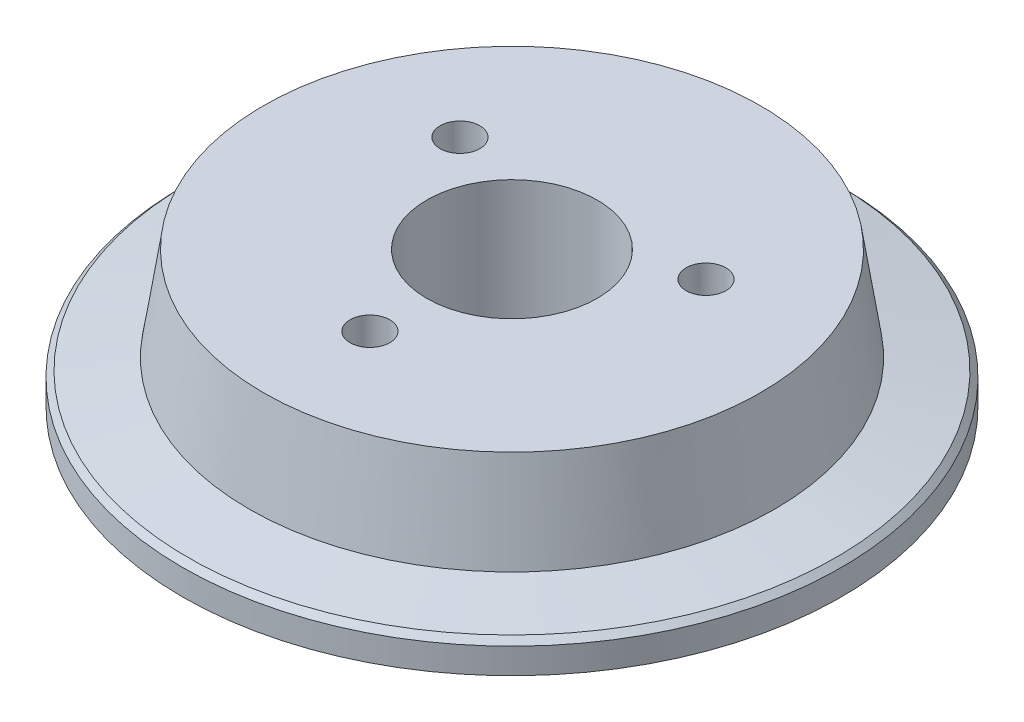
ISO-10303-21;
HEADER;
FILE_DESCRIPTION(('STEP AP214'),'2;1');
FILE_NAME('part.step','',(''),(''),'','','');
FILE_SCHEMA(('AUTOMOTIVE_DESIGN { 1 0 10303 214 1 1 1 1 }'));
ENDSEC;
DATA;
#1=APPLICATION_CONTEXT('core data for automotive mechanical design processes');
#2=APPLICATION_PROTOCOL_DEFINITION('international standard','automotive_design',2000,#1);
#3=PRODUCT_CONTEXT('',#1,'mechanical');
#4=PRODUCT('Part','Part','',(#3));
#5=PRODUCT_RELATED_PRODUCT_CATEGORY('part','',(#4));
#6=PRODUCT_DEFINITION_FORMATION('','',#4);
#7=PRODUCT_DEFINITION_CONTEXT('part definition',#1,'design');
#8=PRODUCT_DEFINITION('design','',#6,#7);
#9=PRODUCT_DEFINITION_SHAPE('','',#8);
#10=(LENGTH_UNIT() NAMED_UNIT(*) SI_UNIT(.MILLI.,.METRE.));
#11=(NAMED_UNIT(*) PLANE_ANGLE_UNIT() SI_UNIT($,.RADIAN.));
#12=(NAMED_UNIT(*) SI_UNIT($,.STERADIAN.) SOLID_ANGLE_UNIT());
#13=UNCERTAINTY_MEASURE_WITH_UNIT(LENGTH_MEASURE(1.E-05),#10,'distance_accuracy_value','');
#14=(GEOMETRIC_REPRESENTATION_CONTEXT(3) GLOBAL_UNCERTAINTY_ASSIGNED_CONTEXT((#13)) GLOBAL_UNIT_ASSIGNED_CONTEXT((#10,
#11,#12)) REPRESENTATION_CONTEXT('',''));
#15=CARTESIAN_POINT('',(0.,0.,0.));
#16=DIRECTION('',(0.,0.,1.));
#17=DIRECTION('',(1.,0.,0.));
#18=AXIS2_PLACEMENT_3D('',#15,#16,#17);
#19=CARTESIAN_POINT('',(0.,0.,0.));
#20=DIRECTION('',(0.,1.,0.));
#21=DIRECTION('',(0.,0.,1.));
#22=AXIS2_PLACEMENT_3D('',#19,#20,#21);
#23=PLANE('',#22);
#24=CARTESIAN_POINT('',(0.,0.,0.));
#25=DIRECTION('',(0.,1.,0.));
#26=DIRECTION('',(0.,0.,1.));
#27=AXIS2_PLACEMENT_3D('',#24,#25,#26);
#28=CIRCLE('',#27,3.);
#29=CARTESIAN_POINT('',(0.,0.,3.));
#30=VERTEX_POINT('',#29);
#31=EDGE_CURVE('E79',#30,#30,#28,.T.);
#32=ORIENTED_EDGE('',*,*,#31,.T.);
#33=EDGE_LOOP('',(#32));
#34=FACE_BOUND('',#33,.T.);
#35=CARTESIAN_POINT('',(0.,0.,0.));
#36=DIRECTION('',(0.,1.,0.));
#37=DIRECTION('',(0.,0.,1.));
#38=AXIS2_PLACEMENT_3D('',#35,#36,#37);
#39=CIRCLE('',#38,11.6);
#40=CARTESIAN_POINT('',(0.,0.,11.6));
#41=VERTEX_POINT('',#40);
#42=EDGE_CURVE('E70',#41,#41,#39,.T.);
#43=ORIENTED_EDGE('',*,*,#42,.F.);
#44=EDGE_LOOP('',(#43));
#45=FACE_BOUND('',#44,.T.);
#46=ADVANCED_FACE('F53',(#34,#45),#23,.F.);
#47=CARTESIAN_POINT('',(0.,1.1,0.));
#48=DIRECTION('',(0.,-1.,0.));
#49=DIRECTION('',(0.,0.,-1.));
#50=AXIS2_PLACEMENT_3D('',#47,#48,#49);
#51=CYLINDRICAL_SURFACE('',#50,11.6);
#52=CARTESIAN_POINT('',(0.,0.900000000000005,0.));
#53=DIRECTION('',(0.,1.,0.));
#54=DIRECTION('',(0.,0.,1.));
#55=AXIS2_PLACEMENT_3D('',#52,#53,#54);
#56=CIRCLE('',#55,11.6);
#57=CARTESIAN_POINT('',(0.,0.900000000000005,11.6));
#58=VERTEX_POINT('',#57);
#59=EDGE_CURVE('E61',#58,#58,#56,.F.);
#60=ORIENTED_EDGE('',*,*,#59,.T.);
#61=EDGE_LOOP('',(#60));
#62=FACE_BOUND('',#61,.T.);
#63=ORIENTED_EDGE('',*,*,#42,.T.);
#64=EDGE_LOOP('',(#63));
#65=FACE_BOUND('',#64,.T.);
#66=ADVANCED_FACE('F137',(#62,#65),#51,.T.);
#67=CARTESIAN_POINT('',(0.,1.1,0.));
#68=DIRECTION('',(0.,-1.,0.));
#69=DIRECTION('',(0.,0.,-1.));
#70=AXIS2_PLACEMENT_3D('',#67,#68,#69);
#71=CONICAL_SURFACE('',#70,11.4,0.785398163397461);
#72=ORIENTED_EDGE('',*,*,#59,.F.);
#73=EDGE_LOOP('',(#72));
#74=FACE_BOUND('',#73,.T.);
#75=CARTESIAN_POINT('',(0.,1.1,0.));
#76=DIRECTION('',(0.,-1.,0.));
#77=DIRECTION('',(0.,0.,-1.));
#78=AXIS2_PLACEMENT_3D('',#75,#76,#77);
#79=CIRCLE('',#78,11.4);
#80=CARTESIAN_POINT('',(0.,1.1,-11.4));
#81=VERTEX_POINT('',#80);
#82=EDGE_CURVE('E65',#81,#81,#79,.F.);
#83=ORIENTED_EDGE('',*,*,#82,.F.);
#84=EDGE_LOOP('',(#83));
#85=FACE_BOUND('',#84,.T.);
#86=ADVANCED_FACE('F143',(#74,#85),#71,.T.);
#87=CARTESIAN_POINT('',(0.,1.5,0.));
#88=DIRECTION('',(0.,-1.,0.));
#89=DIRECTION('',(0.,0.,-1.));
#90=AXIS2_PLACEMENT_3D('',#87,#88,#89);
#91=CONICAL_SURFACE('',#90,9.25,1.38685287025772);
#92=CARTESIAN_POINT('',(0.,1.5,0.));
#93=DIRECTION('',(0.,1.,0.));
#94=DIRECTION('',(0.,0.,1.));
#95=AXIS2_PLACEMENT_3D('',#92,#93,#94);
#96=CIRCLE('',#95,9.25);
#97=CARTESIAN_POINT('',(0.,1.5,9.25));
#98=VERTEX_POINT('',#97);
#99=EDGE_CURVE('E76',#98,#98,#96,.T.);
#100=ORIENTED_EDGE('',*,*,#99,.F.);
#101=EDGE_LOOP('',(#100));
#102=FACE_BOUND('',#101,.T.);
#103=ORIENTED_EDGE('',*,*,#82,.T.);
#104=EDGE_LOOP('',(#103));
#105=FACE_BOUND('',#104,.T.);
#106=ADVANCED_FACE('F117',(#102,#105),#91,.T.);
#107=CARTESIAN_POINT('',(0.,4.8,0.));
#108=DIRECTION('',(0.,1.,0.));
#109=DIRECTION('',(0.,0.,1.));
#110=AXIS2_PLACEMENT_3D('',#107,#108,#109);
#111=PLANE('',#110);
#112=CARTESIAN_POINT('',(0.,4.8,0.));
#113=DIRECTION('',(0.,1.,0.));
#114=DIRECTION('',(0.,0.,1.));
#115=AXIS2_PLACEMENT_3D('',#112,#113,#114);
#116=CIRCLE('',#115,8.75000000000002);
#117=CARTESIAN_POINT('',(0.,4.8,8.75000000000002));
#118=VERTEX_POINT('',#117);
#119=EDGE_CURVE('E11',#118,#118,#116,.T.);
#120=ORIENTED_EDGE('',*,*,#119,.T.);
#121=EDGE_LOOP('',(#120));
#122=FACE_BOUND('',#121,.T.);
#123=CARTESIAN_POINT('',(4.33012701892218,4.8,-2.50000000000002));
#124=DIRECTION('',(0.,1.,0.));
#125=DIRECTION('',(0.866025403784436,0.,-0.500000000000004));
#126=AXIS2_PLACEMENT_3D('',#123,#124,#125);
#127=CIRCLE('',#126,0.7);
#128=CARTESIAN_POINT('',(4.93634480157129,4.8,-2.85000000000002));
#129=VERTEX_POINT('',#128);
#130=EDGE_CURVE('E98',#129,#129,#127,.T.);
#131=ORIENTED_EDGE('',*,*,#130,.F.);
#132=EDGE_LOOP('',(#131));
#133=FACE_BOUND('',#132,.T.);
#134=CARTESIAN_POINT('',(-4.33012701892222,4.8,-2.49999999999996));
#135=DIRECTION('',(0.,1.,0.));
#136=DIRECTION('',(-0.866025403784443,0.,-0.499999999999992));
#137=AXIS2_PLACEMENT_3D('',#134,#135,#136);
#138=CIRCLE('',#137,0.7);
#139=CARTESIAN_POINT('',(-4.93634480157133,4.8,-2.84999999999995));
#140=VERTEX_POINT('',#139);
#141=EDGE_CURVE('E92',#140,#140,#138,.T.);
#142=ORIENTED_EDGE('',*,*,#141,.F.);
#143=EDGE_LOOP('',(#142));
#144=FACE_BOUND('',#143,.T.);
#145=CARTESIAN_POINT('',(0.,4.8,5.));
#146=DIRECTION('',(0.,1.,0.));
#147=DIRECTION('',(0.,0.,1.));
#148=AXIS2_PLACEMENT_3D('',#145,#146,#147);
#149=CIRCLE('',#148,0.7);
#150=CARTESIAN_POINT('',(0.,4.8,5.7));
#151=VERTEX_POINT('',#150);
#152=EDGE_CURVE('E86',#151,#151,#149,.T.);
#153=ORIENTED_EDGE('',*,*,#152,.F.);
#154=EDGE_LOOP('',(#153));
#155=FACE_BOUND('',#154,.T.);
#156=CARTESIAN_POINT('',(0.,4.8,0.));
#157=DIRECTION('',(0.,1.,0.));
#158=DIRECTION('',(0.,0.,1.));
#159=AXIS2_PLACEMENT_3D('',#156,#157,#158);
#160=CIRCLE('',#159,3.);
#161=CARTESIAN_POINT('',(0.,4.8,3.));
#162=VERTEX_POINT('',#161);
#163=EDGE_CURVE('E80',#162,#162,#160,.T.);
#164=ORIENTED_EDGE('',*,*,#163,.F.);
#165=EDGE_LOOP('',(#164));
#166=FACE_BOUND('',#165,.T.);
#167=ADVANCED_FACE('F113',(#122,#133,#144,#155,#166),#111,.T.);
#168=CARTESIAN_POINT('',(0.,0.,0.));
#169=DIRECTION('',(0.,1.,0.));
#170=DIRECTION('',(0.,0.,1.));
#171=AXIS2_PLACEMENT_3D('',#168,#169,#170);
#172=CYLINDRICAL_SURFACE('',#171,3.);
#173=ORIENTED_EDGE('',*,*,#31,.F.);
#174=EDGE_LOOP('',(#173));
#175=FACE_BOUND('',#174,.T.);
#176=ORIENTED_EDGE('',*,*,#163,.T.);
#177=EDGE_LOOP('',(#176));
#178=FACE_BOUND('',#177,.T.);
#179=ADVANCED_FACE('F116',(#175,#178),#172,.F.);
#180=CARTESIAN_POINT('',(0.,1.8,5.));
#181=DIRECTION('',(0.,1.,0.));
#182=DIRECTION('',(0.,0.,1.));
#183=AXIS2_PLACEMENT_3D('',#180,#181,#182);
#184=CYLINDRICAL_SURFACE('',#183,0.7);
#185=CARTESIAN_POINT('',(0.,1.8,5.));
#186=DIRECTION('',(0.,1.,0.));
#187=DIRECTION('',(0.,0.,1.));
#188=AXIS2_PLACEMENT_3D('',#185,#186,#187);
#189=CIRCLE('',#188,0.7);
#190=CARTESIAN_POINT('',(0.,1.8,5.7));
#191=VERTEX_POINT('',#190);
#192=EDGE_CURVE('E83',#191,#191,#189,.T.);
#193=ORIENTED_EDGE('',*,*,#192,.F.);
#194=EDGE_LOOP('',(#193));
#195=FACE_BOUND('',#194,.T.);
#196=ORIENTED_EDGE('',*,*,#152,.T.);
#197=EDGE_LOOP('',(#196));
#198=FACE_BOUND('',#197,.T.);
#199=ADVANCED_FACE('F126',(#195,#198),#184,.F.);
#200=CARTESIAN_POINT('',(0.,1.8,5.));
#201=DIRECTION('',(0.,1.,0.));
#202=DIRECTION('',(0.,0.,1.));
#203=AXIS2_PLACEMENT_3D('',#200,#201,#202);
#204=PLANE('',#203);
#205=ORIENTED_EDGE('',*,*,#192,.T.);
#206=EDGE_LOOP('',(#205));
#207=FACE_BOUND('',#206,.T.);
#208=ADVANCED_FACE('F132',(#207),#204,.T.);
#209=CARTESIAN_POINT('',(-4.33012701892222,1.8,-2.49999999999996));
#210=DIRECTION('',(0.,1.,0.));
#211=DIRECTION('',(0.,0.,1.));
#212=AXIS2_PLACEMENT_3D('',#209,#210,#211);
#213=CYLINDRICAL_SURFACE('',#212,0.7);
#214=CARTESIAN_POINT('',(-4.33012701892222,1.8,-2.49999999999996));
#215=DIRECTION('',(0.,1.,0.));
#216=DIRECTION('',(-0.866025403784443,0.,-0.499999999999992));
#217=AXIS2_PLACEMENT_3D('',#214,#215,#216);
#218=CIRCLE('',#217,0.7);
#219=CARTESIAN_POINT('',(-4.93634480157133,1.8,-2.84999999999995));
#220=VERTEX_POINT('',#219);
#221=EDGE_CURVE('E95',#220,#220,#218,.T.);
#222=ORIENTED_EDGE('',*,*,#221,.F.);
#223=EDGE_LOOP('',(#222));
#224=FACE_BOUND('',#223,.T.);
#225=ORIENTED_EDGE('',*,*,#141,.T.);
#226=EDGE_LOOP('',(#225));
#227=FACE_BOUND('',#226,.T.);
#228=ADVANCED_FACE('F174',(#224,#227),#213,.F.);
#229=CARTESIAN_POINT('',(-4.33012701892222,1.8,-2.49999999999996));
#230=DIRECTION('',(0.,1.,0.));
#231=DIRECTION('',(-0.866025403784443,0.,-0.499999999999992));
#232=AXIS2_PLACEMENT_3D('',#229,#230,#231);
#233=PLANE('',#232);
#234=ORIENTED_EDGE('',*,*,#221,.T.);
#235=EDGE_LOOP('',(#234));
#236=FACE_BOUND('',#235,.T.);
#237=ADVANCED_FACE('F109',(#236),#233,.T.);
#238=CARTESIAN_POINT('',(4.33012701892218,1.8,-2.50000000000002));
#239=DIRECTION('',(0.,1.,0.));
#240=DIRECTION('',(0.,0.,1.));
#241=AXIS2_PLACEMENT_3D('',#238,#239,#240);
#242=CYLINDRICAL_SURFACE('',#241,0.7);
#243=CARTESIAN_POINT('',(4.33012701892218,1.8,-2.50000000000002));
#244=DIRECTION('',(0.,1.,0.));
#245=DIRECTION('',(0.866025403784436,0.,-0.500000000000004));
#246=AXIS2_PLACEMENT_3D('',#243,#244,#245);
#247=CIRCLE('',#246,0.7);
#248=CARTESIAN_POINT('',(4.93634480157129,1.8,-2.85000000000002));
#249=VERTEX_POINT('',#248);
#250=EDGE_CURVE('E89',#249,#249,#247,.T.);
#251=ORIENTED_EDGE('',*,*,#250,.F.);
#252=EDGE_LOOP('',(#251));
#253=FACE_BOUND('',#252,.T.);
#254=ORIENTED_EDGE('',*,*,#130,.T.);
#255=EDGE_LOOP('',(#254));
#256=FACE_BOUND('',#255,.T.);
#257=ADVANCED_FACE('F106',(#253,#256),#242,.F.);
#258=CARTESIAN_POINT('',(4.33012701892218,1.8,-2.50000000000002));
#259=DIRECTION('',(0.,1.,0.));
#260=DIRECTION('',(0.866025403784436,0.,-0.500000000000004));
#261=AXIS2_PLACEMENT_3D('',#258,#259,#260);
#262=PLANE('',#261);
#263=ORIENTED_EDGE('',*,*,#250,.T.);
#264=EDGE_LOOP('',(#263));
#265=FACE_BOUND('',#264,.T.);
#266=ADVANCED_FACE('F104',(#265),#262,.T.);
#267=CARTESIAN_POINT('',(0.,4.8,0.));
#268=DIRECTION('',(0.,-1.,0.));
#269=DIRECTION('',(0.,0.,-1.));
#270=AXIS2_PLACEMENT_3D('',#267,#268,#269);
#271=CONICAL_SURFACE('',#270,8.75000000000002,0.150371428007131);
#272=ORIENTED_EDGE('',*,*,#99,.T.);
#273=EDGE_LOOP('',(#272));
#274=FACE_BOUND('',#273,.T.);
#275=ORIENTED_EDGE('',*,*,#119,.F.);
#276=EDGE_LOOP('',(#275));
#277=FACE_BOUND('',#276,.T.);
#278=ADVANCED_FACE('F56',(#274,#277),#271,.T.);
#279=CLOSED_SHELL('',(#46,#66,#86,#106,#167,#179,#199,#208,#228,#237,#257,#266,#278));
#280=MANIFOLD_SOLID_BREP('B2',#279);
#281=ADVANCED_BREP_SHAPE_REPRESENTATION('',(#18,#280),#14);
#282=SHAPE_DEFINITION_REPRESENTATION(#9,#281);
ENDSEC;
END-ISO-10303-21;
